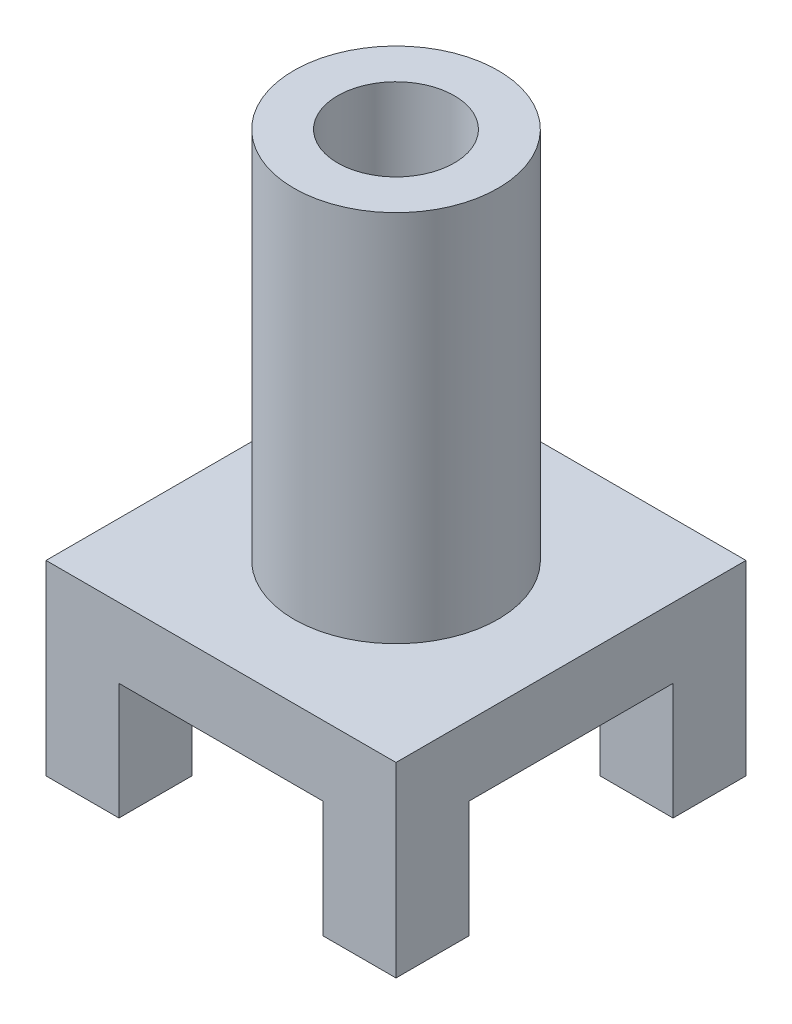
ISO-10303-21;
HEADER;
FILE_DESCRIPTION(('STEP AP214'),'2;1');
FILE_NAME('part.step','',(''),(''),'','','');
FILE_SCHEMA(('AUTOMOTIVE_DESIGN { 1 0 10303 214 1 1 1 1 }'));
ENDSEC;
DATA;
#1=APPLICATION_CONTEXT('core data for automotive mechanical design processes');
#2=APPLICATION_PROTOCOL_DEFINITION('international standard','automotive_design',2000,#1);
#3=PRODUCT_CONTEXT('',#1,'mechanical');
#4=PRODUCT('Part','Part','',(#3));
#5=PRODUCT_RELATED_PRODUCT_CATEGORY('part','',(#4));
#6=PRODUCT_DEFINITION_FORMATION('','',#4);
#7=PRODUCT_DEFINITION_CONTEXT('part definition',#1,'design');
#8=PRODUCT_DEFINITION('design','',#6,#7);
#9=PRODUCT_DEFINITION_SHAPE('','',#8);
#10=(LENGTH_UNIT() NAMED_UNIT(*) SI_UNIT(.MILLI.,.METRE.));
#11=(NAMED_UNIT(*) PLANE_ANGLE_UNIT() SI_UNIT($,.RADIAN.));
#12=(NAMED_UNIT(*) SI_UNIT($,.STERADIAN.) SOLID_ANGLE_UNIT());
#13=UNCERTAINTY_MEASURE_WITH_UNIT(LENGTH_MEASURE(1.E-05),#10,'distance_accuracy_value','');
#14=(GEOMETRIC_REPRESENTATION_CONTEXT(3) GLOBAL_UNCERTAINTY_ASSIGNED_CONTEXT((#13)) GLOBAL_UNIT_ASSIGNED_CONTEXT((#10,
#11,#12)) REPRESENTATION_CONTEXT('',''));
#15=CARTESIAN_POINT('',(0.,0.,0.));
#16=DIRECTION('',(0.,0.,1.));
#17=DIRECTION('',(1.,0.,0.));
#18=AXIS2_PLACEMENT_3D('',#15,#16,#17);
#19=CARTESIAN_POINT('',(0.,0.,0.));
#20=DIRECTION('',(0.,-1.,0.));
#21=DIRECTION('',(0.,0.,-1.));
#22=AXIS2_PLACEMENT_3D('',#19,#20,#21);
#23=PLANE('',#22);
#24=DIRECTION('',(1.,0.,0.));
#25=VECTOR('',#24,1.);
#26=CARTESIAN_POINT('',(-30.,0.,17.5));
#27=LINE('',#26,#25);
#28=CARTESIAN_POINT('',(-30.,0.,17.5));
#29=VERTEX_POINT('',#28);
#30=CARTESIAN_POINT('',(-17.5,0.,17.5));
#31=VERTEX_POINT('',#30);
#32=EDGE_CURVE('E227',#29,#31,#27,.T.);
#33=ORIENTED_EDGE('',*,*,#32,.T.);
#34=DIRECTION('',(0.,0.,1.));
#35=VECTOR('',#34,1.);
#36=CARTESIAN_POINT('',(-17.5,0.,-30.));
#37=LINE('',#36,#35);
#38=CARTESIAN_POINT('',(-17.5,0.,30.));
#39=VERTEX_POINT('',#38);
#40=EDGE_CURVE('E49',#31,#39,#37,.T.);
#41=ORIENTED_EDGE('',*,*,#40,.T.);
#42=DIRECTION('',(1.,0.,0.));
#43=VECTOR('',#42,1.);
#44=CARTESIAN_POINT('',(-30.,0.,30.));
#45=LINE('',#44,#43);
#46=CARTESIAN_POINT('',(-30.,0.,30.));
#47=VERTEX_POINT('',#46);
#48=EDGE_CURVE('E242',#47,#39,#45,.T.);
#49=ORIENTED_EDGE('',*,*,#48,.F.);
#50=DIRECTION('',(0.,0.,1.));
#51=VECTOR('',#50,1.);
#52=CARTESIAN_POINT('',(-30.,0.,-30.));
#53=LINE('',#52,#51);
#54=EDGE_CURVE('E252',#29,#47,#53,.T.);
#55=ORIENTED_EDGE('',*,*,#54,.F.);
#56=EDGE_LOOP('',(#33,#41,#49,#55));
#57=FACE_BOUND('',#56,.T.);
#58=ADVANCED_FACE('F33',(#57),#23,.T.);
#59=DIRECTION('',(1.,0.,0.));
#60=VECTOR('',#59,1.);
#61=CARTESIAN_POINT('',(-30.,0.,-30.));
#62=LINE('',#61,#60);
#63=CARTESIAN_POINT('',(-30.,0.,-30.));
#64=VERTEX_POINT('',#63);
#65=CARTESIAN_POINT('',(-17.5,0.,-30.));
#66=VERTEX_POINT('',#65);
#67=EDGE_CURVE('E249',#64,#66,#62,.T.);
#68=ORIENTED_EDGE('',*,*,#67,.T.);
#69=CARTESIAN_POINT('',(-17.5,0.,-17.5));
#70=VERTEX_POINT('',#69);
#71=EDGE_CURVE('E186',#66,#70,#37,.T.);
#72=ORIENTED_EDGE('',*,*,#71,.T.);
#73=DIRECTION('',(1.,0.,0.));
#74=VECTOR('',#73,1.);
#75=CARTESIAN_POINT('',(-30.,0.,-17.5));
#76=LINE('',#75,#74);
#77=CARTESIAN_POINT('',(-30.,0.,-17.5));
#78=VERTEX_POINT('',#77);
#79=EDGE_CURVE('E223',#78,#70,#76,.T.);
#80=ORIENTED_EDGE('',*,*,#79,.F.);
#81=EDGE_CURVE('E233',#64,#78,#53,.T.);
#82=ORIENTED_EDGE('',*,*,#81,.F.);
#83=EDGE_LOOP('',(#68,#72,#80,#82));
#84=FACE_BOUND('',#83,.T.);
#85=ADVANCED_FACE('F305',(#84),#23,.T.);
#86=CARTESIAN_POINT('',(-30.,0.,17.5));
#87=DIRECTION('',(0.,0.,1.));
#88=DIRECTION('',(1.,0.,0.));
#89=AXIS2_PLACEMENT_3D('',#86,#87,#88);
#90=PLANE('',#89);
#91=DIRECTION('',(0.,1.,0.));
#92=VECTOR('',#91,1.);
#93=CARTESIAN_POINT('',(-17.5,0.,17.5));
#94=LINE('',#93,#92);
#95=CARTESIAN_POINT('',(-17.5,20.,17.5));
#96=VERTEX_POINT('',#95);
#97=EDGE_CURVE('E164',#31,#96,#94,.T.);
#98=ORIENTED_EDGE('',*,*,#97,.F.);
#99=ORIENTED_EDGE('',*,*,#32,.F.);
#100=DIRECTION('',(0.,-1.,0.));
#101=VECTOR('',#100,1.);
#102=CARTESIAN_POINT('',(-30.,0.,17.5));
#103=LINE('',#102,#101);
#104=CARTESIAN_POINT('',(-30.,20.,17.5));
#105=VERTEX_POINT('',#104);
#106=EDGE_CURVE('E197',#105,#29,#103,.T.);
#107=ORIENTED_EDGE('',*,*,#106,.F.);
#108=DIRECTION('',(1.,0.,0.));
#109=VECTOR('',#108,1.);
#110=CARTESIAN_POINT('',(-30.,20.,17.5));
#111=LINE('',#110,#109);
#112=EDGE_CURVE('E215',#105,#96,#111,.T.);
#113=ORIENTED_EDGE('',*,*,#112,.T.);
#114=EDGE_LOOP('',(#98,#99,#107,#113));
#115=FACE_BOUND('',#114,.T.);
#116=ADVANCED_FACE('F296',(#115),#90,.F.);
#117=CARTESIAN_POINT('',(-30.,0.,-17.5));
#118=DIRECTION('',(0.,0.,-1.));
#119=DIRECTION('',(0.,1.,0.));
#120=AXIS2_PLACEMENT_3D('',#117,#118,#119);
#121=PLANE('',#120);
#122=DIRECTION('',(0.,-1.,0.));
#123=VECTOR('',#122,1.);
#124=CARTESIAN_POINT('',(-17.5,0.,-17.5));
#125=LINE('',#124,#123);
#126=CARTESIAN_POINT('',(-17.5,20.,-17.5));
#127=VERTEX_POINT('',#126);
#128=EDGE_CURVE('E263',#127,#70,#125,.T.);
#129=ORIENTED_EDGE('',*,*,#128,.F.);
#130=DIRECTION('',(1.,0.,0.));
#131=VECTOR('',#130,1.);
#132=CARTESIAN_POINT('',(-30.,20.,-17.5));
#133=LINE('',#132,#131);
#134=CARTESIAN_POINT('',(-30.,20.,-17.5));
#135=VERTEX_POINT('',#134);
#136=EDGE_CURVE('E220',#135,#127,#133,.T.);
#137=ORIENTED_EDGE('',*,*,#136,.F.);
#138=DIRECTION('',(0.,1.,0.));
#139=VECTOR('',#138,1.);
#140=CARTESIAN_POINT('',(-30.,0.,-17.5));
#141=LINE('',#140,#139);
#142=EDGE_CURVE('E200',#78,#135,#141,.T.);
#143=ORIENTED_EDGE('',*,*,#142,.F.);
#144=ORIENTED_EDGE('',*,*,#79,.T.);
#145=EDGE_LOOP('',(#129,#137,#143,#144));
#146=FACE_BOUND('',#145,.T.);
#147=ADVANCED_FACE('F301',(#146),#121,.F.);
#148=DIRECTION('',(0.,0.,1.));
#149=VECTOR('',#148,1.);
#150=CARTESIAN_POINT('',(17.5,0.,-30.));
#151=LINE('',#150,#149);
#152=CARTESIAN_POINT('',(17.5,0.,17.5));
#153=VERTEX_POINT('',#152);
#154=CARTESIAN_POINT('',(17.5,0.,30.));
#155=VERTEX_POINT('',#154);
#156=EDGE_CURVE('E189',#153,#155,#151,.T.);
#157=ORIENTED_EDGE('',*,*,#156,.F.);
#158=CARTESIAN_POINT('',(30.,0.,17.5));
#159=VERTEX_POINT('',#158);
#160=EDGE_CURVE('E207',#153,#159,#27,.T.);
#161=ORIENTED_EDGE('',*,*,#160,.T.);
#162=DIRECTION('',(0.,0.,1.));
#163=VECTOR('',#162,1.);
#164=CARTESIAN_POINT('',(30.,0.,-30.));
#165=LINE('',#164,#163);
#166=CARTESIAN_POINT('',(30.,0.,30.));
#167=VERTEX_POINT('',#166);
#168=EDGE_CURVE('E245',#159,#167,#165,.T.);
#169=ORIENTED_EDGE('',*,*,#168,.T.);
#170=EDGE_CURVE('E218',#155,#167,#45,.T.);
#171=ORIENTED_EDGE('',*,*,#170,.F.);
#172=EDGE_LOOP('',(#157,#161,#169,#171));
#173=FACE_BOUND('',#172,.T.);
#174=ADVANCED_FACE('F287',(#173),#23,.T.);
#175=CARTESIAN_POINT('',(-30.,32.,30.));
#176=DIRECTION('',(0.,0.,-1.));
#177=DIRECTION('',(-1.,0.,0.));
#178=AXIS2_PLACEMENT_3D('',#175,#176,#177);
#179=PLANE('',#178);
#180=DIRECTION('',(1.,0.,0.));
#181=VECTOR('',#180,1.);
#182=CARTESIAN_POINT('',(-17.5,20.,30.));
#183=LINE('',#182,#181);
#184=CARTESIAN_POINT('',(-17.5,20.,30.));
#185=VERTEX_POINT('',#184);
#186=CARTESIAN_POINT('',(17.5,20.,30.));
#187=VERTEX_POINT('',#186);
#188=EDGE_CURVE('E176',#185,#187,#183,.T.);
#189=ORIENTED_EDGE('',*,*,#188,.T.);
#190=DIRECTION('',(0.,1.,0.));
#191=VECTOR('',#190,1.);
#192=CARTESIAN_POINT('',(17.5,0.,30.));
#193=LINE('',#192,#191);
#194=EDGE_CURVE('E179',#155,#187,#193,.T.);
#195=ORIENTED_EDGE('',*,*,#194,.F.);
#196=ORIENTED_EDGE('',*,*,#170,.T.);
#197=DIRECTION('',(0.,-1.,0.));
#198=VECTOR('',#197,1.);
#199=CARTESIAN_POINT('',(30.,32.,30.));
#200=LINE('',#199,#198);
#201=CARTESIAN_POINT('',(30.,32.,30.));
#202=VERTEX_POINT('',#201);
#203=EDGE_CURVE('E261',#202,#167,#200,.T.);
#204=ORIENTED_EDGE('',*,*,#203,.F.);
#205=DIRECTION('',(1.,0.,0.));
#206=VECTOR('',#205,1.);
#207=CARTESIAN_POINT('',(-30.,32.,30.));
#208=LINE('',#207,#206);
#209=CARTESIAN_POINT('',(-30.,32.,30.));
#210=VERTEX_POINT('',#209);
#211=EDGE_CURVE('E230',#210,#202,#208,.T.);
#212=ORIENTED_EDGE('',*,*,#211,.F.);
#213=DIRECTION('',(0.,-1.,0.));
#214=VECTOR('',#213,1.);
#215=CARTESIAN_POINT('',(-30.,32.,30.));
#216=LINE('',#215,#214);
#217=EDGE_CURVE('E241',#210,#47,#216,.T.);
#218=ORIENTED_EDGE('',*,*,#217,.T.);
#219=ORIENTED_EDGE('',*,*,#48,.T.);
#220=DIRECTION('',(0.,1.,0.));
#221=VECTOR('',#220,1.);
#222=CARTESIAN_POINT('',(-17.5,0.,30.));
#223=LINE('',#222,#221);
#224=EDGE_CURVE('E158',#39,#185,#223,.T.);
#225=ORIENTED_EDGE('',*,*,#224,.T.);
#226=EDGE_LOOP('',(#189,#195,#196,#204,#212,#218,#219,#225));
#227=FACE_BOUND('',#226,.T.);
#228=ADVANCED_FACE('F35',(#227),#179,.F.);
#229=CARTESIAN_POINT('',(30.,32.,-30.));
#230=DIRECTION('',(1.,0.,0.));
#231=DIRECTION('',(0.,0.,-1.));
#232=AXIS2_PLACEMENT_3D('',#229,#230,#231);
#233=PLANE('',#232);
#234=DIRECTION('',(0.,-1.,0.));
#235=VECTOR('',#234,1.);
#236=CARTESIAN_POINT('',(30.,0.,17.5));
#237=LINE('',#236,#235);
#238=CARTESIAN_POINT('',(30.,20.,17.5));
#239=VERTEX_POINT('',#238);
#240=EDGE_CURVE('E196',#239,#159,#237,.T.);
#241=ORIENTED_EDGE('',*,*,#240,.F.);
#242=DIRECTION('',(0.,0.,1.));
#243=VECTOR('',#242,1.);
#244=CARTESIAN_POINT('',(30.,20.,17.5));
#245=LINE('',#244,#243);
#246=CARTESIAN_POINT('',(30.,20.,-17.5));
#247=VERTEX_POINT('',#246);
#248=EDGE_CURVE('E201',#247,#239,#245,.T.);
#249=ORIENTED_EDGE('',*,*,#248,.F.);
#250=DIRECTION('',(0.,1.,0.));
#251=VECTOR('',#250,1.);
#252=CARTESIAN_POINT('',(30.,0.,-17.5));
#253=LINE('',#252,#251);
#254=CARTESIAN_POINT('',(30.,0.,-17.5));
#255=VERTEX_POINT('',#254);
#256=EDGE_CURVE('E210',#255,#247,#253,.T.);
#257=ORIENTED_EDGE('',*,*,#256,.F.);
#258=CARTESIAN_POINT('',(30.,0.,-30.));
#259=VERTEX_POINT('',#258);
#260=EDGE_CURVE('E246',#259,#255,#165,.T.);
#261=ORIENTED_EDGE('',*,*,#260,.F.);
#262=DIRECTION('',(0.,-1.,0.));
#263=VECTOR('',#262,1.);
#264=CARTESIAN_POINT('',(30.,32.,-30.));
#265=LINE('',#264,#263);
#266=CARTESIAN_POINT('',(30.,32.,-30.));
#267=VERTEX_POINT('',#266);
#268=EDGE_CURVE('E259',#267,#259,#265,.T.);
#269=ORIENTED_EDGE('',*,*,#268,.F.);
#270=DIRECTION('',(0.,0.,1.));
#271=VECTOR('',#270,1.);
#272=CARTESIAN_POINT('',(30.,32.,-30.));
#273=LINE('',#272,#271);
#274=EDGE_CURVE('E232',#267,#202,#273,.T.);
#275=ORIENTED_EDGE('',*,*,#274,.T.);
#276=ORIENTED_EDGE('',*,*,#203,.T.);
#277=ORIENTED_EDGE('',*,*,#168,.F.);
#278=EDGE_LOOP('',(#241,#249,#257,#261,#269,#275,#276,#277));
#279=FACE_BOUND('',#278,.T.);
#280=ADVANCED_FACE('F273',(#279),#233,.T.);
#281=CARTESIAN_POINT('',(-30.,32.,-30.));
#282=DIRECTION('',(0.,0.,-1.));
#283=DIRECTION('',(-1.,0.,0.));
#284=AXIS2_PLACEMENT_3D('',#281,#282,#283);
#285=PLANE('',#284);
#286=DIRECTION('',(0.,1.,0.));
#287=VECTOR('',#286,1.);
#288=CARTESIAN_POINT('',(17.5,0.,-30.));
#289=LINE('',#288,#287);
#290=CARTESIAN_POINT('',(17.5,0.,-30.));
#291=VERTEX_POINT('',#290);
#292=CARTESIAN_POINT('',(17.5,20.,-30.));
#293=VERTEX_POINT('',#292);
#294=EDGE_CURVE('E157',#291,#293,#289,.T.);
#295=ORIENTED_EDGE('',*,*,#294,.T.);
#296=DIRECTION('',(1.,0.,0.));
#297=VECTOR('',#296,1.);
#298=CARTESIAN_POINT('',(-17.5,20.,-30.));
#299=LINE('',#298,#297);
#300=CARTESIAN_POINT('',(-17.5,20.,-30.));
#301=VERTEX_POINT('',#300);
#302=EDGE_CURVE('E147',#301,#293,#299,.T.);
#303=ORIENTED_EDGE('',*,*,#302,.F.);
#304=DIRECTION('',(0.,1.,0.));
#305=VECTOR('',#304,1.);
#306=CARTESIAN_POINT('',(-17.5,0.,-30.));
#307=LINE('',#306,#305);
#308=EDGE_CURVE('E171',#66,#301,#307,.T.);
#309=ORIENTED_EDGE('',*,*,#308,.F.);
#310=ORIENTED_EDGE('',*,*,#67,.F.);
#311=DIRECTION('',(0.,-1.,0.));
#312=VECTOR('',#311,1.);
#313=CARTESIAN_POINT('',(-30.,32.,-30.));
#314=LINE('',#313,#312);
#315=CARTESIAN_POINT('',(-30.,32.,-30.));
#316=VERTEX_POINT('',#315);
#317=EDGE_CURVE('E257',#316,#64,#314,.T.);
#318=ORIENTED_EDGE('',*,*,#317,.F.);
#319=DIRECTION('',(1.,0.,0.));
#320=VECTOR('',#319,1.);
#321=CARTESIAN_POINT('',(-30.,32.,-30.));
#322=LINE('',#321,#320);
#323=EDGE_CURVE('E236',#316,#267,#322,.T.);
#324=ORIENTED_EDGE('',*,*,#323,.T.);
#325=ORIENTED_EDGE('',*,*,#268,.T.);
#326=EDGE_CURVE('E170',#291,#259,#62,.T.);
#327=ORIENTED_EDGE('',*,*,#326,.F.);
#328=EDGE_LOOP('',(#295,#303,#309,#310,#318,#324,#325,#327));
#329=FACE_BOUND('',#328,.T.);
#330=ADVANCED_FACE('F168',(#329),#285,.T.);
#331=CARTESIAN_POINT('',(-30.,32.,-30.));
#332=DIRECTION('',(1.,0.,0.));
#333=DIRECTION('',(0.,0.,-1.));
#334=AXIS2_PLACEMENT_3D('',#331,#332,#333);
#335=PLANE('',#334);
#336=DIRECTION('',(0.,0.,1.));
#337=VECTOR('',#336,1.);
#338=CARTESIAN_POINT('',(-30.,20.,17.5));
#339=LINE('',#338,#337);
#340=EDGE_CURVE('E204',#135,#105,#339,.T.);
#341=ORIENTED_EDGE('',*,*,#340,.T.);
#342=ORIENTED_EDGE('',*,*,#106,.T.);
#343=ORIENTED_EDGE('',*,*,#54,.T.);
#344=ORIENTED_EDGE('',*,*,#217,.F.);
#345=DIRECTION('',(0.,0.,1.));
#346=VECTOR('',#345,1.);
#347=CARTESIAN_POINT('',(-30.,32.,-30.));
#348=LINE('',#347,#346);
#349=EDGE_CURVE('E239',#316,#210,#348,.T.);
#350=ORIENTED_EDGE('',*,*,#349,.F.);
#351=ORIENTED_EDGE('',*,*,#317,.T.);
#352=ORIENTED_EDGE('',*,*,#81,.T.);
#353=ORIENTED_EDGE('',*,*,#142,.T.);
#354=EDGE_LOOP('',(#341,#342,#343,#344,#350,#351,#352,#353));
#355=FACE_BOUND('',#354,.T.);
#356=ADVANCED_FACE('F299',(#355),#335,.F.);
#357=CARTESIAN_POINT('',(0.,32.,0.));
#358=DIRECTION('',(0.,-1.,0.));
#359=DIRECTION('',(0.,0.,-1.));
#360=AXIS2_PLACEMENT_3D('',#357,#358,#359);
#361=PLANE('',#360);
#362=CARTESIAN_POINT('',(0.,32.,0.));
#363=DIRECTION('',(0.,1.,0.));
#364=DIRECTION('',(0.,0.,1.));
#365=AXIS2_PLACEMENT_3D('',#362,#363,#364);
#366=CIRCLE('',#365,17.5);
#367=CARTESIAN_POINT('',(0.,32.,17.5));
#368=VERTEX_POINT('',#367);
#369=EDGE_CURVE('E11',#368,#368,#366,.T.);
#370=ORIENTED_EDGE('',*,*,#369,.F.);
#371=EDGE_LOOP('',(#370));
#372=FACE_BOUND('',#371,.T.);
#373=ORIENTED_EDGE('',*,*,#211,.T.);
#374=ORIENTED_EDGE('',*,*,#274,.F.);
#375=ORIENTED_EDGE('',*,*,#323,.F.);
#376=ORIENTED_EDGE('',*,*,#349,.T.);
#377=EDGE_LOOP('',(#373,#374,#375,#376));
#378=FACE_BOUND('',#377,.T.);
#379=ADVANCED_FACE('F332',(#372,#378),#361,.F.);
#380=CARTESIAN_POINT('',(17.5,0.,-17.5));
#381=VERTEX_POINT('',#380);
#382=EDGE_CURVE('E190',#291,#381,#151,.T.);
#383=ORIENTED_EDGE('',*,*,#382,.F.);
#384=ORIENTED_EDGE('',*,*,#326,.T.);
#385=ORIENTED_EDGE('',*,*,#260,.T.);
#386=EDGE_CURVE('E226',#381,#255,#76,.T.);
#387=ORIENTED_EDGE('',*,*,#386,.F.);
#388=EDGE_LOOP('',(#383,#384,#385,#387));
#389=FACE_BOUND('',#388,.T.);
#390=ADVANCED_FACE('F269',(#389),#23,.T.);
#391=ORIENTED_EDGE('',*,*,#160,.F.);
#392=DIRECTION('',(0.,1.,0.));
#393=VECTOR('',#392,1.);
#394=CARTESIAN_POINT('',(17.5,0.,17.5));
#395=LINE('',#394,#393);
#396=CARTESIAN_POINT('',(17.5,20.,17.5));
#397=VERTEX_POINT('',#396);
#398=EDGE_CURVE('E193',#153,#397,#395,.T.);
#399=ORIENTED_EDGE('',*,*,#398,.T.);
#400=EDGE_CURVE('E219',#397,#239,#111,.T.);
#401=ORIENTED_EDGE('',*,*,#400,.T.);
#402=ORIENTED_EDGE('',*,*,#240,.T.);
#403=EDGE_LOOP('',(#391,#399,#401,#402));
#404=FACE_BOUND('',#403,.T.);
#405=ADVANCED_FACE('F280',(#404),#90,.F.);
#406=CARTESIAN_POINT('',(-30.,20.,17.5));
#407=DIRECTION('',(0.,1.,0.));
#408=DIRECTION('',(0.,0.,1.));
#409=AXIS2_PLACEMENT_3D('',#406,#407,#408);
#410=PLANE('',#409);
#411=CARTESIAN_POINT('',(0.,20.,0.));
#412=DIRECTION('',(0.,1.,0.));
#413=DIRECTION('',(0.,0.,1.));
#414=AXIS2_PLACEMENT_3D('',#411,#412,#413);
#415=CIRCLE('',#414,10.);
#416=CARTESIAN_POINT('',(0.,20.,10.));
#417=VERTEX_POINT('',#416);
#418=EDGE_CURVE('E490',#417,#417,#415,.T.);
#419=ORIENTED_EDGE('',*,*,#418,.T.);
#420=EDGE_LOOP('',(#419));
#421=FACE_BOUND('',#420,.T.);
#422=ORIENTED_EDGE('',*,*,#400,.F.);
#423=DIRECTION('',(0.,0.,1.));
#424=VECTOR('',#423,1.);
#425=CARTESIAN_POINT('',(17.5,20.,-30.));
#426=LINE('',#425,#424);
#427=EDGE_CURVE('E165',#397,#187,#426,.T.);
#428=ORIENTED_EDGE('',*,*,#427,.T.);
#429=ORIENTED_EDGE('',*,*,#188,.F.);
#430=DIRECTION('',(0.,0.,1.));
#431=VECTOR('',#430,1.);
#432=CARTESIAN_POINT('',(-17.5,20.,-30.));
#433=LINE('',#432,#431);
#434=EDGE_CURVE('E173',#96,#185,#433,.T.);
#435=ORIENTED_EDGE('',*,*,#434,.F.);
#436=ORIENTED_EDGE('',*,*,#112,.F.);
#437=ORIENTED_EDGE('',*,*,#340,.F.);
#438=ORIENTED_EDGE('',*,*,#136,.T.);
#439=EDGE_CURVE('E57',#301,#127,#433,.T.);
#440=ORIENTED_EDGE('',*,*,#439,.F.);
#441=ORIENTED_EDGE('',*,*,#302,.T.);
#442=CARTESIAN_POINT('',(17.5,20.,-17.5));
#443=VERTEX_POINT('',#442);
#444=EDGE_CURVE('E151',#293,#443,#426,.T.);
#445=ORIENTED_EDGE('',*,*,#444,.T.);
#446=EDGE_CURVE('E222',#443,#247,#133,.T.);
#447=ORIENTED_EDGE('',*,*,#446,.T.);
#448=ORIENTED_EDGE('',*,*,#248,.T.);
#449=EDGE_LOOP('',(#422,#428,#429,#435,#436,#437,#438,#440,#441,#445,#447,#448));
#450=FACE_BOUND('',#449,.T.);
#451=ADVANCED_FACE('F150',(#421,#450),#410,.F.);
#452=ORIENTED_EDGE('',*,*,#446,.F.);
#453=DIRECTION('',(0.,-1.,0.));
#454=VECTOR('',#453,1.);
#455=CARTESIAN_POINT('',(17.5,0.,-17.5));
#456=LINE('',#455,#454);
#457=EDGE_CURVE('E37',#443,#381,#456,.T.);
#458=ORIENTED_EDGE('',*,*,#457,.T.);
#459=ORIENTED_EDGE('',*,*,#386,.T.);
#460=ORIENTED_EDGE('',*,*,#256,.T.);
#461=EDGE_LOOP('',(#452,#458,#459,#460));
#462=FACE_BOUND('',#461,.T.);
#463=ADVANCED_FACE('F266',(#462),#121,.F.);
#464=CARTESIAN_POINT('',(-17.5,0.,-30.));
#465=DIRECTION('',(1.,0.,0.));
#466=DIRECTION('',(0.,0.,-1.));
#467=AXIS2_PLACEMENT_3D('',#464,#465,#466);
#468=PLANE('',#467);
#469=ORIENTED_EDGE('',*,*,#128,.T.);
#470=ORIENTED_EDGE('',*,*,#71,.F.);
#471=ORIENTED_EDGE('',*,*,#308,.T.);
#472=ORIENTED_EDGE('',*,*,#439,.T.);
#473=EDGE_LOOP('',(#469,#470,#471,#472));
#474=FACE_BOUND('',#473,.T.);
#475=ADVANCED_FACE('F310',(#474),#468,.T.);
#476=CARTESIAN_POINT('',(17.5,0.,-30.));
#477=DIRECTION('',(1.,0.,0.));
#478=DIRECTION('',(0.,0.,-1.));
#479=AXIS2_PLACEMENT_3D('',#476,#477,#478);
#480=PLANE('',#479);
#481=ORIENTED_EDGE('',*,*,#444,.F.);
#482=ORIENTED_EDGE('',*,*,#294,.F.);
#483=ORIENTED_EDGE('',*,*,#382,.T.);
#484=ORIENTED_EDGE('',*,*,#457,.F.);
#485=EDGE_LOOP('',(#481,#482,#483,#484));
#486=FACE_BOUND('',#485,.T.);
#487=ADVANCED_FACE('F161',(#486),#480,.F.);
#488=ORIENTED_EDGE('',*,*,#156,.T.);
#489=ORIENTED_EDGE('',*,*,#194,.T.);
#490=ORIENTED_EDGE('',*,*,#427,.F.);
#491=ORIENTED_EDGE('',*,*,#398,.F.);
#492=EDGE_LOOP('',(#488,#489,#490,#491));
#493=FACE_BOUND('',#492,.T.);
#494=ADVANCED_FACE('F283',(#493),#480,.F.);
#495=ORIENTED_EDGE('',*,*,#97,.T.);
#496=ORIENTED_EDGE('',*,*,#434,.T.);
#497=ORIENTED_EDGE('',*,*,#224,.F.);
#498=ORIENTED_EDGE('',*,*,#40,.F.);
#499=EDGE_LOOP('',(#495,#496,#497,#498));
#500=FACE_BOUND('',#499,.T.);
#501=ADVANCED_FACE('F313',(#500),#468,.T.);
#502=CARTESIAN_POINT('',(0.,96.,0.));
#503=DIRECTION('',(0.,-1.,0.));
#504=DIRECTION('',(0.,0.,-1.));
#505=AXIS2_PLACEMENT_3D('',#502,#503,#504);
#506=CYLINDRICAL_SURFACE('',#505,17.5);
#507=CARTESIAN_POINT('',(0.,96.,0.));
#508=DIRECTION('',(0.,1.,0.));
#509=DIRECTION('',(0.,0.,1.));
#510=AXIS2_PLACEMENT_3D('',#507,#508,#509);
#511=CIRCLE('',#510,17.5);
#512=CARTESIAN_POINT('',(0.,96.,17.5));
#513=VERTEX_POINT('',#512);
#514=EDGE_CURVE('E180',#513,#513,#511,.T.);
#515=ORIENTED_EDGE('',*,*,#514,.F.);
#516=EDGE_LOOP('',(#515));
#517=FACE_BOUND('',#516,.T.);
#518=ORIENTED_EDGE('',*,*,#369,.T.);
#519=EDGE_LOOP('',(#518));
#520=FACE_BOUND('',#519,.T.);
#521=ADVANCED_FACE('F322',(#517,#520),#506,.T.);
#522=CARTESIAN_POINT('',(0.,96.,0.));
#523=DIRECTION('',(0.,1.,0.));
#524=DIRECTION('',(0.,0.,1.));
#525=AXIS2_PLACEMENT_3D('',#522,#523,#524);
#526=PLANE('',#525);
#527=CARTESIAN_POINT('',(0.,96.,0.));
#528=DIRECTION('',(0.,1.,0.));
#529=DIRECTION('',(0.,0.,1.));
#530=AXIS2_PLACEMENT_3D('',#527,#528,#529);
#531=CIRCLE('',#530,10.);
#532=CARTESIAN_POINT('',(0.,96.,10.));
#533=VERTEX_POINT('',#532);
#534=EDGE_CURVE('E487',#533,#533,#531,.T.);
#535=ORIENTED_EDGE('',*,*,#534,.F.);
#536=EDGE_LOOP('',(#535));
#537=FACE_BOUND('',#536,.T.);
#538=ORIENTED_EDGE('',*,*,#514,.T.);
#539=EDGE_LOOP('',(#538));
#540=FACE_BOUND('',#539,.T.);
#541=ADVANCED_FACE('F366',(#537,#540),#526,.T.);
#542=CARTESIAN_POINT('',(0.,0.,0.));
#543=DIRECTION('',(0.,1.,0.));
#544=DIRECTION('',(0.,0.,1.));
#545=AXIS2_PLACEMENT_3D('',#542,#543,#544);
#546=CYLINDRICAL_SURFACE('',#545,10.);
#547=ORIENTED_EDGE('',*,*,#534,.T.);
#548=EDGE_LOOP('',(#547));
#549=FACE_BOUND('',#548,.T.);
#550=ORIENTED_EDGE('',*,*,#418,.F.);
#551=EDGE_LOOP('',(#550));
#552=FACE_BOUND('',#551,.T.);
#553=ADVANCED_FACE('F374',(#549,#552),#546,.F.);
#554=CLOSED_SHELL('',(#58,#85,#116,#147,#174,#228,#280,#330,#356,#379,#390,#405,#451,#463,#475,
#487,#494,#501,#521,#541,#553));
#555=MANIFOLD_SOLID_BREP('B2',#554);
#556=ADVANCED_BREP_SHAPE_REPRESENTATION('',(#18,#555),#14);
#557=SHAPE_DEFINITION_REPRESENTATION(#9,#556);
ENDSEC;
END-ISO-10303-21;
